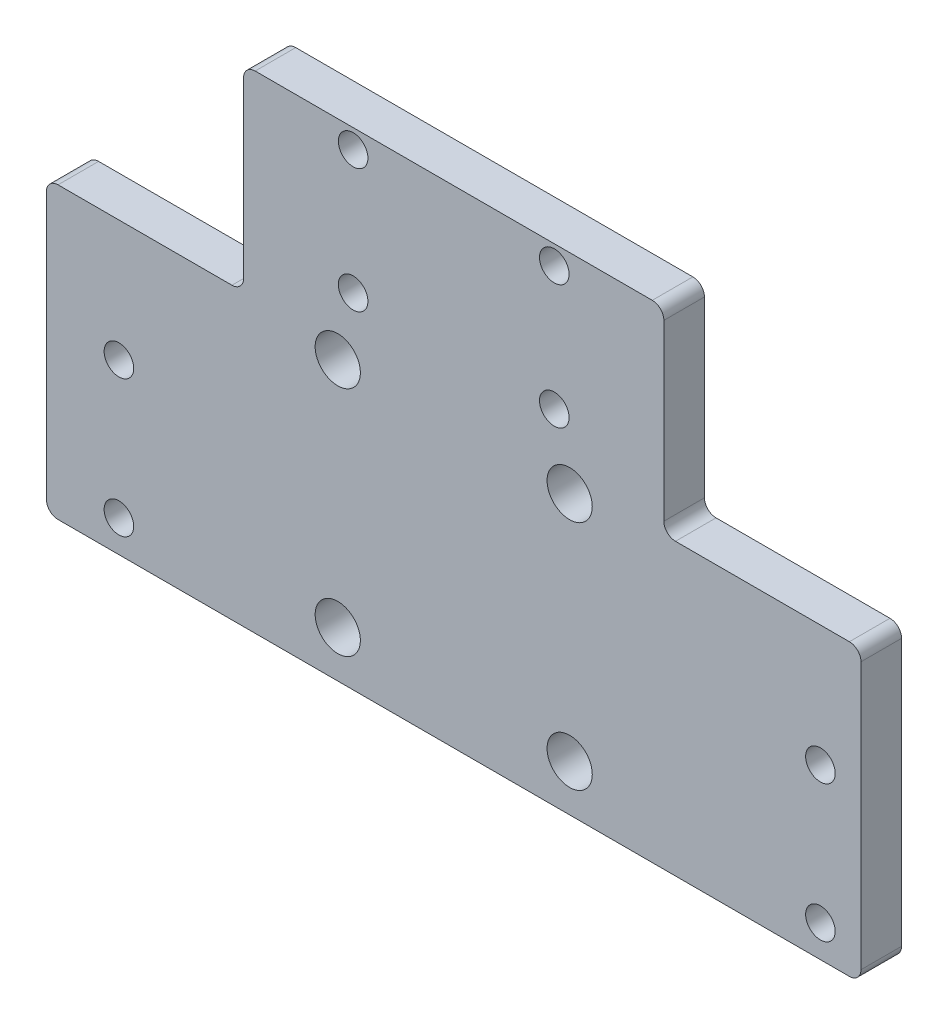
ISO-10303-21;
HEADER;
FILE_DESCRIPTION(('STEP AP214'),'2;1');
FILE_NAME('part.step','',(''),(''),'','','');
FILE_SCHEMA(('AUTOMOTIVE_DESIGN { 1 0 10303 214 1 1 1 1 }'));
ENDSEC;
DATA;
#1=APPLICATION_CONTEXT('core data for automotive mechanical design processes');
#2=APPLICATION_PROTOCOL_DEFINITION('international standard','automotive_design',2000,#1);
#3=PRODUCT_CONTEXT('',#1,'mechanical');
#4=PRODUCT('Part','Part','',(#3));
#5=PRODUCT_RELATED_PRODUCT_CATEGORY('part','',(#4));
#6=PRODUCT_DEFINITION_FORMATION('','',#4);
#7=PRODUCT_DEFINITION_CONTEXT('part definition',#1,'design');
#8=PRODUCT_DEFINITION('design','',#6,#7);
#9=PRODUCT_DEFINITION_SHAPE('','',#8);
#10=(LENGTH_UNIT() NAMED_UNIT(*) SI_UNIT(.MILLI.,.METRE.));
#11=(NAMED_UNIT(*) PLANE_ANGLE_UNIT() SI_UNIT($,.RADIAN.));
#12=(NAMED_UNIT(*) SI_UNIT($,.STERADIAN.) SOLID_ANGLE_UNIT());
#13=UNCERTAINTY_MEASURE_WITH_UNIT(LENGTH_MEASURE(1.E-05),#10,'distance_accuracy_value','');
#14=(GEOMETRIC_REPRESENTATION_CONTEXT(3) GLOBAL_UNCERTAINTY_ASSIGNED_CONTEXT((#13)) GLOBAL_UNIT_ASSIGNED_CONTEXT((#10,
#11,#12)) REPRESENTATION_CONTEXT('',''));
#15=CARTESIAN_POINT('',(0.,0.,0.));
#16=DIRECTION('',(0.,0.,1.));
#17=DIRECTION('',(1.,0.,0.));
#18=AXIS2_PLACEMENT_3D('',#15,#16,#17);
#19=CARTESIAN_POINT('',(0.,0.,7.));
#20=DIRECTION('',(0.,0.,1.));
#21=DIRECTION('',(1.,0.,0.));
#22=AXIS2_PLACEMENT_3D('',#19,#20,#21);
#23=PLANE('',#22);
#24=CARTESIAN_POINT('',(17.35,125.3,7.));
#25=DIRECTION('',(0.,0.,1.));
#26=DIRECTION('',(1.,0.,0.));
#27=AXIS2_PLACEMENT_3D('',#24,#25,#26);
#28=CIRCLE('',#27,2.55);
#29=CARTESIAN_POINT('',(19.9,125.3,7.));
#30=VERTEX_POINT('',#29);
#31=EDGE_CURVE('E483',#30,#30,#28,.T.);
#32=ORIENTED_EDGE('',*,*,#31,.F.);
#33=EDGE_LOOP('',(#32));
#34=FACE_BOUND('',#33,.T.);
#35=CARTESIAN_POINT('',(63.25,95.1,7.));
#36=DIRECTION('',(0.,0.,1.));
#37=DIRECTION('',(1.,0.,0.));
#38=AXIS2_PLACEMENT_3D('',#35,#36,#37);
#39=CIRCLE('',#38,2.54999999999999);
#40=CARTESIAN_POINT('',(65.8,95.1,7.));
#41=VERTEX_POINT('',#40);
#42=EDGE_CURVE('E492',#41,#41,#39,.T.);
#43=ORIENTED_EDGE('',*,*,#42,.F.);
#44=EDGE_LOOP('',(#43));
#45=FACE_BOUND('',#44,.T.);
#46=CARTESIAN_POINT('',(63.25,71.5,7.));
#47=DIRECTION('',(0.,0.,1.));
#48=DIRECTION('',(1.,0.,0.));
#49=AXIS2_PLACEMENT_3D('',#46,#47,#48);
#50=CIRCLE('',#49,2.54999999999999);
#51=CARTESIAN_POINT('',(65.8,71.5,7.));
#52=VERTEX_POINT('',#51);
#53=EDGE_CURVE('E467',#52,#52,#50,.T.);
#54=ORIENTED_EDGE('',*,*,#53,.F.);
#55=EDGE_LOOP('',(#54));
#56=FACE_BOUND('',#55,.T.);
#57=CARTESIAN_POINT('',(-57.75,95.1,7.));
#58=DIRECTION('',(0.,0.,1.));
#59=DIRECTION('',(1.,0.,0.));
#60=AXIS2_PLACEMENT_3D('',#57,#58,#59);
#61=CIRCLE('',#60,2.55);
#62=CARTESIAN_POINT('',(-55.2,95.1,7.));
#63=VERTEX_POINT('',#62);
#64=EDGE_CURVE('E476',#63,#63,#61,.T.);
#65=ORIENTED_EDGE('',*,*,#64,.F.);
#66=EDGE_LOOP('',(#65));
#67=FACE_BOUND('',#66,.T.);
#68=CARTESIAN_POINT('',(-17.35,146.7,7.));
#69=DIRECTION('',(0.,0.,1.));
#70=DIRECTION('',(1.,0.,0.));
#71=AXIS2_PLACEMENT_3D('',#68,#69,#70);
#72=CIRCLE('',#71,2.55);
#73=CARTESIAN_POINT('',(-14.8,146.7,7.));
#74=VERTEX_POINT('',#73);
#75=EDGE_CURVE('E515',#74,#74,#72,.T.);
#76=ORIENTED_EDGE('',*,*,#75,.F.);
#77=EDGE_LOOP('',(#76));
#78=FACE_BOUND('',#77,.T.);
#79=CARTESIAN_POINT('',(-17.35,125.3,7.));
#80=DIRECTION('',(0.,0.,1.));
#81=DIRECTION('',(-1.,0.,0.));
#82=AXIS2_PLACEMENT_3D('',#79,#80,#81);
#83=CIRCLE('',#82,2.55);
#84=CARTESIAN_POINT('',(-19.9,125.3,7.));
#85=VERTEX_POINT('',#84);
#86=EDGE_CURVE('E499',#85,#85,#83,.T.);
#87=ORIENTED_EDGE('',*,*,#86,.F.);
#88=EDGE_LOOP('',(#87));
#89=FACE_BOUND('',#88,.T.);
#90=CARTESIAN_POINT('',(17.35,146.7,7.));
#91=DIRECTION('',(0.,0.,1.));
#92=DIRECTION('',(-1.,0.,0.));
#93=AXIS2_PLACEMENT_3D('',#90,#91,#92);
#94=CIRCLE('',#93,2.55);
#95=CARTESIAN_POINT('',(14.8,146.7,7.));
#96=VERTEX_POINT('',#95);
#97=EDGE_CURVE('E508',#96,#96,#94,.T.);
#98=ORIENTED_EDGE('',*,*,#97,.F.);
#99=EDGE_LOOP('',(#98));
#100=FACE_BOUND('',#99,.T.);
#101=CARTESIAN_POINT('',(-57.75,71.5,7.));
#102=DIRECTION('',(0.,0.,1.));
#103=DIRECTION('',(1.,0.,0.));
#104=AXIS2_PLACEMENT_3D('',#101,#102,#103);
#105=CIRCLE('',#104,2.55);
#106=CARTESIAN_POINT('',(-55.2,71.5,7.));
#107=VERTEX_POINT('',#106);
#108=EDGE_CURVE('E459',#107,#107,#105,.T.);
#109=ORIENTED_EDGE('',*,*,#108,.F.);
#110=EDGE_LOOP('',(#109));
#111=FACE_BOUND('',#110,.T.);
#112=CARTESIAN_POINT('',(20.,74.,7.));
#113=DIRECTION('',(0.,0.,1.));
#114=DIRECTION('',(1.,0.,0.));
#115=AXIS2_PLACEMENT_3D('',#112,#113,#114);
#116=CIRCLE('',#115,3.9);
#117=CARTESIAN_POINT('',(23.9,74.,7.));
#118=VERTEX_POINT('',#117);
#119=EDGE_CURVE('E439',#118,#118,#116,.T.);
#120=ORIENTED_EDGE('',*,*,#119,.F.);
#121=EDGE_LOOP('',(#120));
#122=FACE_BOUND('',#121,.T.);
#123=CARTESIAN_POINT('',(-20.,114.,7.));
#124=DIRECTION('',(0.,0.,1.));
#125=DIRECTION('',(1.,0.,0.));
#126=AXIS2_PLACEMENT_3D('',#123,#124,#125);
#127=CIRCLE('',#126,3.9);
#128=CARTESIAN_POINT('',(-16.1,114.,7.));
#129=VERTEX_POINT('',#128);
#130=EDGE_CURVE('E314',#129,#129,#127,.T.);
#131=ORIENTED_EDGE('',*,*,#130,.F.);
#132=EDGE_LOOP('',(#131));
#133=FACE_BOUND('',#132,.T.);
#134=DIRECTION('',(0.,1.,0.));
#135=VECTOR('',#134,1.);
#136=CARTESIAN_POINT('',(70.25,66.,7.));
#137=LINE('',#136,#135);
#138=CARTESIAN_POINT('',(70.25,68.,7.));
#139=VERTEX_POINT('',#138);
#140=CARTESIAN_POINT('',(70.25,114.,7.));
#141=VERTEX_POINT('',#140);
#142=EDGE_CURVE('E331',#139,#141,#137,.T.);
#143=ORIENTED_EDGE('',*,*,#142,.T.);
#144=CARTESIAN_POINT('',(68.25,114.,7.));
#145=DIRECTION('',(0.,0.,1.));
#146=DIRECTION('',(1.,0.,0.));
#147=AXIS2_PLACEMENT_3D('',#144,#145,#146);
#148=CIRCLE('',#147,2.);
#149=CARTESIAN_POINT('',(68.25,116.,7.));
#150=VERTEX_POINT('',#149);
#151=EDGE_CURVE('E243',#141,#150,#148,.T.);
#152=ORIENTED_EDGE('',*,*,#151,.T.);
#153=DIRECTION('',(-1.,0.,0.));
#154=VECTOR('',#153,1.);
#155=CARTESIAN_POINT('',(70.25,116.,7.));
#156=LINE('',#155,#154);
#157=CARTESIAN_POINT('',(38.25,116.,7.));
#158=VERTEX_POINT('',#157);
#159=EDGE_CURVE('E174',#150,#158,#156,.T.);
#160=ORIENTED_EDGE('',*,*,#159,.T.);
#161=CARTESIAN_POINT('',(38.25,118.,7.));
#162=DIRECTION('',(0.,0.,1.));
#163=DIRECTION('',(1.,0.,0.));
#164=AXIS2_PLACEMENT_3D('',#161,#162,#163);
#165=CIRCLE('',#164,2.);
#166=CARTESIAN_POINT('',(36.25,118.,7.));
#167=VERTEX_POINT('',#166);
#168=EDGE_CURVE('E289',#158,#167,#165,.F.);
#169=ORIENTED_EDGE('',*,*,#168,.T.);
#170=DIRECTION('',(0.,1.,0.));
#171=VECTOR('',#170,1.);
#172=CARTESIAN_POINT('',(36.25,116.,7.));
#173=LINE('',#172,#171);
#174=CARTESIAN_POINT('',(36.25,148.,7.));
#175=VERTEX_POINT('',#174);
#176=EDGE_CURVE('E339',#167,#175,#173,.T.);
#177=ORIENTED_EDGE('',*,*,#176,.T.);
#178=CARTESIAN_POINT('',(34.25,148.,7.));
#179=DIRECTION('',(0.,0.,1.));
#180=DIRECTION('',(1.,0.,0.));
#181=AXIS2_PLACEMENT_3D('',#178,#179,#180);
#182=CIRCLE('',#181,2.);
#183=CARTESIAN_POINT('',(34.25,150.,7.));
#184=VERTEX_POINT('',#183);
#185=EDGE_CURVE('E231',#175,#184,#182,.T.);
#186=ORIENTED_EDGE('',*,*,#185,.T.);
#187=DIRECTION('',(-1.,0.,0.));
#188=VECTOR('',#187,1.);
#189=CARTESIAN_POINT('',(36.25,150.,7.));
#190=LINE('',#189,#188);
#191=CARTESIAN_POINT('',(-34.25,150.,7.));
#192=VERTEX_POINT('',#191);
#193=EDGE_CURVE('E307',#184,#192,#190,.T.);
#194=ORIENTED_EDGE('',*,*,#193,.T.);
#195=CARTESIAN_POINT('',(-34.25,148.,7.));
#196=DIRECTION('',(0.,0.,1.));
#197=DIRECTION('',(1.,0.,0.));
#198=AXIS2_PLACEMENT_3D('',#195,#196,#197);
#199=CIRCLE('',#198,2.);
#200=CARTESIAN_POINT('',(-36.25,148.,7.));
#201=VERTEX_POINT('',#200);
#202=EDGE_CURVE('E228',#192,#201,#199,.T.);
#203=ORIENTED_EDGE('',*,*,#202,.T.);
#204=DIRECTION('',(0.,-1.,0.));
#205=VECTOR('',#204,1.);
#206=CARTESIAN_POINT('',(-36.25,150.,7.));
#207=LINE('',#206,#205);
#208=CARTESIAN_POINT('',(-36.25,118.,7.));
#209=VERTEX_POINT('',#208);
#210=EDGE_CURVE('E304',#201,#209,#207,.T.);
#211=ORIENTED_EDGE('',*,*,#210,.T.);
#212=CARTESIAN_POINT('',(-38.25,118.,7.));
#213=DIRECTION('',(0.,0.,1.));
#214=DIRECTION('',(1.,0.,0.));
#215=AXIS2_PLACEMENT_3D('',#212,#213,#214);
#216=CIRCLE('',#215,2.);
#217=CARTESIAN_POINT('',(-38.25,116.,7.));
#218=VERTEX_POINT('',#217);
#219=EDGE_CURVE('E11',#209,#218,#216,.F.);
#220=ORIENTED_EDGE('',*,*,#219,.T.);
#221=DIRECTION('',(-1.,0.,0.));
#222=VECTOR('',#221,1.);
#223=CARTESIAN_POINT('',(-36.25,116.,7.));
#224=LINE('',#223,#222);
#225=CARTESIAN_POINT('',(-68.25,116.,7.));
#226=VERTEX_POINT('',#225);
#227=EDGE_CURVE('E208',#218,#226,#224,.T.);
#228=ORIENTED_EDGE('',*,*,#227,.T.);
#229=CARTESIAN_POINT('',(-68.25,114.,7.));
#230=DIRECTION('',(0.,0.,1.));
#231=DIRECTION('',(1.,0.,0.));
#232=AXIS2_PLACEMENT_3D('',#229,#230,#231);
#233=CIRCLE('',#232,2.);
#234=CARTESIAN_POINT('',(-70.25,114.,7.));
#235=VERTEX_POINT('',#234);
#236=EDGE_CURVE('E240',#226,#235,#233,.T.);
#237=ORIENTED_EDGE('',*,*,#236,.T.);
#238=DIRECTION('',(0.,-1.,0.));
#239=VECTOR('',#238,1.);
#240=CARTESIAN_POINT('',(-70.25,116.,7.));
#241=LINE('',#240,#239);
#242=CARTESIAN_POINT('',(-70.25,68.,7.));
#243=VERTEX_POINT('',#242);
#244=EDGE_CURVE('E206',#235,#243,#241,.T.);
#245=ORIENTED_EDGE('',*,*,#244,.T.);
#246=CARTESIAN_POINT('',(-68.25,68.,7.));
#247=DIRECTION('',(0.,0.,1.));
#248=DIRECTION('',(1.,0.,0.));
#249=AXIS2_PLACEMENT_3D('',#246,#247,#248);
#250=CIRCLE('',#249,2.);
#251=CARTESIAN_POINT('',(-68.25,66.,7.));
#252=VERTEX_POINT('',#251);
#253=EDGE_CURVE('E237',#243,#252,#250,.T.);
#254=ORIENTED_EDGE('',*,*,#253,.T.);
#255=DIRECTION('',(1.,0.,0.));
#256=VECTOR('',#255,1.);
#257=CARTESIAN_POINT('',(-70.25,66.,7.));
#258=LINE('',#257,#256);
#259=CARTESIAN_POINT('',(68.25,66.,7.));
#260=VERTEX_POINT('',#259);
#261=EDGE_CURVE('E332',#252,#260,#258,.T.);
#262=ORIENTED_EDGE('',*,*,#261,.T.);
#263=CARTESIAN_POINT('',(68.25,68.,7.));
#264=DIRECTION('',(0.,0.,1.));
#265=DIRECTION('',(1.,0.,0.));
#266=AXIS2_PLACEMENT_3D('',#263,#264,#265);
#267=CIRCLE('',#266,2.);
#268=EDGE_CURVE('E234',#260,#139,#267,.T.);
#269=ORIENTED_EDGE('',*,*,#268,.T.);
#270=EDGE_LOOP('',(#143,#152,#160,#169,#177,#186,#194,#203,#211,#220,#228,#237,#245,#254,#262,#269));
#271=FACE_BOUND('',#270,.T.);
#272=CARTESIAN_POINT('',(-20.,74.,7.));
#273=DIRECTION('',(0.,0.,1.));
#274=DIRECTION('',(1.,0.,0.));
#275=AXIS2_PLACEMENT_3D('',#272,#273,#274);
#276=CIRCLE('',#275,3.9);
#277=CARTESIAN_POINT('',(-16.1,74.,7.));
#278=VERTEX_POINT('',#277);
#279=EDGE_CURVE('E431',#278,#278,#276,.T.);
#280=ORIENTED_EDGE('',*,*,#279,.F.);
#281=EDGE_LOOP('',(#280));
#282=FACE_BOUND('',#281,.T.);
#283=CARTESIAN_POINT('',(20.,114.,7.));
#284=DIRECTION('',(0.,0.,1.));
#285=DIRECTION('',(1.,0.,0.));
#286=AXIS2_PLACEMENT_3D('',#283,#284,#285);
#287=CIRCLE('',#286,3.9);
#288=CARTESIAN_POINT('',(23.9,114.,7.));
#289=VERTEX_POINT('',#288);
#290=EDGE_CURVE('E447',#289,#289,#287,.T.);
#291=ORIENTED_EDGE('',*,*,#290,.F.);
#292=EDGE_LOOP('',(#291));
#293=FACE_BOUND('',#292,.T.);
#294=ADVANCED_FACE('F39',(#34,#45,#56,#67,#78,#89,#100,#111,#122,#133,#271,#282,#293),#23,.T.);
#295=CARTESIAN_POINT('',(0.,0.,0.));
#296=DIRECTION('',(0.,0.,1.));
#297=DIRECTION('',(1.,0.,0.));
#298=AXIS2_PLACEMENT_3D('',#295,#296,#297);
#299=PLANE('',#298);
#300=CARTESIAN_POINT('',(17.35,125.3,0.));
#301=DIRECTION('',(0.,0.,1.));
#302=DIRECTION('',(1.,0.,0.));
#303=AXIS2_PLACEMENT_3D('',#300,#301,#302);
#304=CIRCLE('',#303,2.55);
#305=CARTESIAN_POINT('',(19.9,125.3,0.));
#306=VERTEX_POINT('',#305);
#307=EDGE_CURVE('E487',#306,#306,#304,.T.);
#308=ORIENTED_EDGE('',*,*,#307,.T.);
#309=EDGE_LOOP('',(#308));
#310=FACE_BOUND('',#309,.T.);
#311=CARTESIAN_POINT('',(63.25,95.1,0.));
#312=DIRECTION('',(0.,0.,1.));
#313=DIRECTION('',(1.,0.,0.));
#314=AXIS2_PLACEMENT_3D('',#311,#312,#313);
#315=CIRCLE('',#314,2.54999999999999);
#316=CARTESIAN_POINT('',(65.8,95.1,0.));
#317=VERTEX_POINT('',#316);
#318=EDGE_CURVE('E472',#317,#317,#315,.T.);
#319=ORIENTED_EDGE('',*,*,#318,.T.);
#320=EDGE_LOOP('',(#319));
#321=FACE_BOUND('',#320,.T.);
#322=CARTESIAN_POINT('',(63.25,71.5,0.));
#323=DIRECTION('',(0.,0.,1.));
#324=DIRECTION('',(1.,0.,0.));
#325=AXIS2_PLACEMENT_3D('',#322,#323,#324);
#326=CIRCLE('',#325,2.54999999999999);
#327=CARTESIAN_POINT('',(65.8,71.5,0.));
#328=VERTEX_POINT('',#327);
#329=EDGE_CURVE('E471',#328,#328,#326,.T.);
#330=ORIENTED_EDGE('',*,*,#329,.T.);
#331=EDGE_LOOP('',(#330));
#332=FACE_BOUND('',#331,.T.);
#333=CARTESIAN_POINT('',(-57.75,95.1,0.));
#334=DIRECTION('',(0.,0.,1.));
#335=DIRECTION('',(1.,0.,0.));
#336=AXIS2_PLACEMENT_3D('',#333,#334,#335);
#337=CIRCLE('',#336,2.55);
#338=CARTESIAN_POINT('',(-55.2,95.1,0.));
#339=VERTEX_POINT('',#338);
#340=EDGE_CURVE('E463',#339,#339,#337,.T.);
#341=ORIENTED_EDGE('',*,*,#340,.T.);
#342=EDGE_LOOP('',(#341));
#343=FACE_BOUND('',#342,.T.);
#344=CARTESIAN_POINT('',(-17.35,146.7,0.));
#345=DIRECTION('',(0.,0.,1.));
#346=DIRECTION('',(1.,0.,0.));
#347=AXIS2_PLACEMENT_3D('',#344,#345,#346);
#348=CIRCLE('',#347,2.55);
#349=CARTESIAN_POINT('',(-14.8,146.7,0.));
#350=VERTEX_POINT('',#349);
#351=EDGE_CURVE('E504',#350,#350,#348,.T.);
#352=ORIENTED_EDGE('',*,*,#351,.T.);
#353=EDGE_LOOP('',(#352));
#354=FACE_BOUND('',#353,.T.);
#355=CARTESIAN_POINT('',(-17.35,125.3,0.));
#356=DIRECTION('',(0.,0.,1.));
#357=DIRECTION('',(-1.,0.,0.));
#358=AXIS2_PLACEMENT_3D('',#355,#356,#357);
#359=CIRCLE('',#358,2.55);
#360=CARTESIAN_POINT('',(-19.9,125.3,0.));
#361=VERTEX_POINT('',#360);
#362=EDGE_CURVE('E503',#361,#361,#359,.T.);
#363=ORIENTED_EDGE('',*,*,#362,.T.);
#364=EDGE_LOOP('',(#363));
#365=FACE_BOUND('',#364,.T.);
#366=CARTESIAN_POINT('',(17.35,146.7,0.));
#367=DIRECTION('',(0.,0.,1.));
#368=DIRECTION('',(-1.,0.,0.));
#369=AXIS2_PLACEMENT_3D('',#366,#367,#368);
#370=CIRCLE('',#369,2.55);
#371=CARTESIAN_POINT('',(14.8,146.7,0.));
#372=VERTEX_POINT('',#371);
#373=EDGE_CURVE('E488',#372,#372,#370,.T.);
#374=ORIENTED_EDGE('',*,*,#373,.T.);
#375=EDGE_LOOP('',(#374));
#376=FACE_BOUND('',#375,.T.);
#377=CARTESIAN_POINT('',(-57.75,71.5,0.));
#378=DIRECTION('',(0.,0.,1.));
#379=DIRECTION('',(1.,0.,0.));
#380=AXIS2_PLACEMENT_3D('',#377,#378,#379);
#381=CIRCLE('',#380,2.55);
#382=CARTESIAN_POINT('',(-55.2,71.5,0.));
#383=VERTEX_POINT('',#382);
#384=EDGE_CURVE('E455',#383,#383,#381,.T.);
#385=ORIENTED_EDGE('',*,*,#384,.T.);
#386=EDGE_LOOP('',(#385));
#387=FACE_BOUND('',#386,.T.);
#388=DIRECTION('',(-1.,0.,0.));
#389=VECTOR('',#388,1.);
#390=CARTESIAN_POINT('',(70.25,116.,0.));
#391=LINE('',#390,#389);
#392=CARTESIAN_POINT('',(68.25,116.,0.));
#393=VERTEX_POINT('',#392);
#394=CARTESIAN_POINT('',(38.25,116.,0.));
#395=VERTEX_POINT('',#394);
#396=EDGE_CURVE('E171',#393,#395,#391,.T.);
#397=ORIENTED_EDGE('',*,*,#396,.F.);
#398=CARTESIAN_POINT('',(68.25,114.,0.));
#399=DIRECTION('',(0.,0.,1.));
#400=DIRECTION('',(1.,0.,0.));
#401=AXIS2_PLACEMENT_3D('',#398,#399,#400);
#402=CIRCLE('',#401,2.);
#403=CARTESIAN_POINT('',(70.25,114.,0.));
#404=VERTEX_POINT('',#403);
#405=EDGE_CURVE('E153',#393,#404,#402,.F.);
#406=ORIENTED_EDGE('',*,*,#405,.T.);
#407=DIRECTION('',(0.,1.,0.));
#408=VECTOR('',#407,1.);
#409=CARTESIAN_POINT('',(70.25,66.,0.));
#410=LINE('',#409,#408);
#411=CARTESIAN_POINT('',(70.25,68.,0.));
#412=VERTEX_POINT('',#411);
#413=EDGE_CURVE('E185',#412,#404,#410,.T.);
#414=ORIENTED_EDGE('',*,*,#413,.F.);
#415=CARTESIAN_POINT('',(68.25,68.,0.));
#416=DIRECTION('',(0.,0.,1.));
#417=DIRECTION('',(1.,0.,0.));
#418=AXIS2_PLACEMENT_3D('',#415,#416,#417);
#419=CIRCLE('',#418,2.);
#420=CARTESIAN_POINT('',(68.25,66.,0.));
#421=VERTEX_POINT('',#420);
#422=EDGE_CURVE('E215',#412,#421,#419,.F.);
#423=ORIENTED_EDGE('',*,*,#422,.T.);
#424=DIRECTION('',(1.,0.,0.));
#425=VECTOR('',#424,1.);
#426=CARTESIAN_POINT('',(-70.25,66.,0.));
#427=LINE('',#426,#425);
#428=CARTESIAN_POINT('',(-68.25,66.,0.));
#429=VERTEX_POINT('',#428);
#430=EDGE_CURVE('E192',#429,#421,#427,.T.);
#431=ORIENTED_EDGE('',*,*,#430,.F.);
#432=CARTESIAN_POINT('',(-68.25,68.,0.));
#433=DIRECTION('',(0.,0.,1.));
#434=DIRECTION('',(1.,0.,0.));
#435=AXIS2_PLACEMENT_3D('',#432,#433,#434);
#436=CIRCLE('',#435,2.);
#437=CARTESIAN_POINT('',(-70.25,68.,0.));
#438=VERTEX_POINT('',#437);
#439=EDGE_CURVE('E218',#429,#438,#436,.F.);
#440=ORIENTED_EDGE('',*,*,#439,.T.);
#441=DIRECTION('',(0.,-1.,0.));
#442=VECTOR('',#441,1.);
#443=CARTESIAN_POINT('',(-70.25,116.,0.));
#444=LINE('',#443,#442);
#445=CARTESIAN_POINT('',(-70.25,114.,0.));
#446=VERTEX_POINT('',#445);
#447=EDGE_CURVE('E311',#446,#438,#444,.T.);
#448=ORIENTED_EDGE('',*,*,#447,.F.);
#449=CARTESIAN_POINT('',(-68.25,114.,0.));
#450=DIRECTION('',(0.,0.,1.));
#451=DIRECTION('',(1.,0.,0.));
#452=AXIS2_PLACEMENT_3D('',#449,#450,#451);
#453=CIRCLE('',#452,2.);
#454=CARTESIAN_POINT('',(-68.25,116.,0.));
#455=VERTEX_POINT('',#454);
#456=EDGE_CURVE('E165',#446,#455,#453,.F.);
#457=ORIENTED_EDGE('',*,*,#456,.T.);
#458=DIRECTION('',(-1.,0.,0.));
#459=VECTOR('',#458,1.);
#460=CARTESIAN_POINT('',(-36.25,116.,0.));
#461=LINE('',#460,#459);
#462=CARTESIAN_POINT('',(-38.25,116.,0.));
#463=VERTEX_POINT('',#462);
#464=EDGE_CURVE('E203',#463,#455,#461,.T.);
#465=ORIENTED_EDGE('',*,*,#464,.F.);
#466=CARTESIAN_POINT('',(-38.25,118.,0.));
#467=DIRECTION('',(0.,0.,1.));
#468=DIRECTION('',(1.,0.,0.));
#469=AXIS2_PLACEMENT_3D('',#466,#467,#468);
#470=CIRCLE('',#469,2.);
#471=CARTESIAN_POINT('',(-36.25,118.,0.));
#472=VERTEX_POINT('',#471);
#473=EDGE_CURVE('E48',#463,#472,#470,.T.);
#474=ORIENTED_EDGE('',*,*,#473,.T.);
#475=DIRECTION('',(0.,-1.,0.));
#476=VECTOR('',#475,1.);
#477=CARTESIAN_POINT('',(-36.25,150.,0.));
#478=LINE('',#477,#476);
#479=CARTESIAN_POINT('',(-36.25,148.,0.));
#480=VERTEX_POINT('',#479);
#481=EDGE_CURVE('E199',#480,#472,#478,.T.);
#482=ORIENTED_EDGE('',*,*,#481,.F.);
#483=CARTESIAN_POINT('',(-34.25,148.,0.));
#484=DIRECTION('',(0.,0.,1.));
#485=DIRECTION('',(1.,0.,0.));
#486=AXIS2_PLACEMENT_3D('',#483,#484,#485);
#487=CIRCLE('',#486,2.);
#488=CARTESIAN_POINT('',(-34.25,150.,0.));
#489=VERTEX_POINT('',#488);
#490=EDGE_CURVE('E176',#480,#489,#487,.F.);
#491=ORIENTED_EDGE('',*,*,#490,.T.);
#492=DIRECTION('',(-1.,0.,0.));
#493=VECTOR('',#492,1.);
#494=CARTESIAN_POINT('',(36.25,150.,0.));
#495=LINE('',#494,#493);
#496=CARTESIAN_POINT('',(34.25,150.,0.));
#497=VERTEX_POINT('',#496);
#498=EDGE_CURVE('E190',#497,#489,#495,.T.);
#499=ORIENTED_EDGE('',*,*,#498,.F.);
#500=CARTESIAN_POINT('',(34.25,148.,0.));
#501=DIRECTION('',(0.,0.,1.));
#502=DIRECTION('',(1.,0.,0.));
#503=AXIS2_PLACEMENT_3D('',#500,#501,#502);
#504=CIRCLE('',#503,2.);
#505=CARTESIAN_POINT('',(36.25,148.,0.));
#506=VERTEX_POINT('',#505);
#507=EDGE_CURVE('E212',#497,#506,#504,.F.);
#508=ORIENTED_EDGE('',*,*,#507,.T.);
#509=DIRECTION('',(0.,1.,0.));
#510=VECTOR('',#509,1.);
#511=CARTESIAN_POINT('',(36.25,116.,0.));
#512=LINE('',#511,#510);
#513=CARTESIAN_POINT('',(36.25,118.,0.));
#514=VERTEX_POINT('',#513);
#515=EDGE_CURVE('E184',#514,#506,#512,.T.);
#516=ORIENTED_EDGE('',*,*,#515,.F.);
#517=CARTESIAN_POINT('',(38.25,118.,0.));
#518=DIRECTION('',(0.,0.,1.));
#519=DIRECTION('',(1.,0.,0.));
#520=AXIS2_PLACEMENT_3D('',#517,#518,#519);
#521=CIRCLE('',#520,2.);
#522=EDGE_CURVE('E182',#514,#395,#521,.T.);
#523=ORIENTED_EDGE('',*,*,#522,.T.);
#524=EDGE_LOOP('',(#397,#406,#414,#423,#431,#440,#448,#457,#465,#474,#482,#491,#499,#508,#516,#523));
#525=FACE_BOUND('',#524,.T.);
#526=CARTESIAN_POINT('',(-20.,114.,0.));
#527=DIRECTION('',(0.,0.,1.));
#528=DIRECTION('',(1.,0.,0.));
#529=AXIS2_PLACEMENT_3D('',#526,#527,#528);
#530=CIRCLE('',#529,3.9);
#531=CARTESIAN_POINT('',(-16.1,114.,0.));
#532=VERTEX_POINT('',#531);
#533=EDGE_CURVE('E427',#532,#532,#530,.T.);
#534=ORIENTED_EDGE('',*,*,#533,.T.);
#535=EDGE_LOOP('',(#534));
#536=FACE_BOUND('',#535,.T.);
#537=CARTESIAN_POINT('',(-20.,74.,0.));
#538=DIRECTION('',(0.,0.,1.));
#539=DIRECTION('',(1.,0.,0.));
#540=AXIS2_PLACEMENT_3D('',#537,#538,#539);
#541=CIRCLE('',#540,3.9);
#542=CARTESIAN_POINT('',(-16.1,74.,0.));
#543=VERTEX_POINT('',#542);
#544=EDGE_CURVE('E435',#543,#543,#541,.T.);
#545=ORIENTED_EDGE('',*,*,#544,.T.);
#546=EDGE_LOOP('',(#545));
#547=FACE_BOUND('',#546,.T.);
#548=CARTESIAN_POINT('',(20.,74.,0.));
#549=DIRECTION('',(0.,0.,1.));
#550=DIRECTION('',(1.,0.,0.));
#551=AXIS2_PLACEMENT_3D('',#548,#549,#550);
#552=CIRCLE('',#551,3.9);
#553=CARTESIAN_POINT('',(23.9,74.,0.));
#554=VERTEX_POINT('',#553);
#555=EDGE_CURVE('E443',#554,#554,#552,.T.);
#556=ORIENTED_EDGE('',*,*,#555,.T.);
#557=EDGE_LOOP('',(#556));
#558=FACE_BOUND('',#557,.T.);
#559=CARTESIAN_POINT('',(20.,114.,0.));
#560=DIRECTION('',(0.,0.,1.));
#561=DIRECTION('',(1.,0.,0.));
#562=AXIS2_PLACEMENT_3D('',#559,#560,#561);
#563=CIRCLE('',#562,3.9);
#564=CARTESIAN_POINT('',(23.9,114.,0.));
#565=VERTEX_POINT('',#564);
#566=EDGE_CURVE('E451',#565,#565,#563,.T.);
#567=ORIENTED_EDGE('',*,*,#566,.T.);
#568=EDGE_LOOP('',(#567));
#569=FACE_BOUND('',#568,.T.);
#570=ADVANCED_FACE('F179',(#310,#321,#332,#343,#354,#365,#376,#387,#525,#536,#547,#558,#569),
#299,.F.);
#571=CARTESIAN_POINT('',(-70.25,116.,7.));
#572=DIRECTION('',(1.,0.,0.));
#573=DIRECTION('',(0.,0.,-1.));
#574=AXIS2_PLACEMENT_3D('',#571,#572,#573);
#575=PLANE('',#574);
#576=ORIENTED_EDGE('',*,*,#244,.F.);
#577=DIRECTION('',(0.,0.,-1.));
#578=VECTOR('',#577,1.);
#579=CARTESIAN_POINT('',(-70.25,114.,7.));
#580=LINE('',#579,#578);
#581=EDGE_CURVE('E249',#235,#446,#580,.T.);
#582=ORIENTED_EDGE('',*,*,#581,.T.);
#583=ORIENTED_EDGE('',*,*,#447,.T.);
#584=DIRECTION('',(0.,0.,-1.));
#585=VECTOR('',#584,1.);
#586=CARTESIAN_POINT('',(-70.25,68.,7.));
#587=LINE('',#586,#585);
#588=EDGE_CURVE('E246',#438,#243,#587,.F.);
#589=ORIENTED_EDGE('',*,*,#588,.T.);
#590=EDGE_LOOP('',(#576,#582,#583,#589));
#591=FACE_BOUND('',#590,.T.);
#592=ADVANCED_FACE('F383',(#591),#575,.F.);
#593=CARTESIAN_POINT('',(-70.25,66.,7.));
#594=DIRECTION('',(0.,1.,0.));
#595=DIRECTION('',(0.,0.,1.));
#596=AXIS2_PLACEMENT_3D('',#593,#594,#595);
#597=PLANE('',#596);
#598=ORIENTED_EDGE('',*,*,#261,.F.);
#599=DIRECTION('',(0.,0.,-1.));
#600=VECTOR('',#599,1.);
#601=CARTESIAN_POINT('',(-68.25,66.,7.));
#602=LINE('',#601,#600);
#603=EDGE_CURVE('E262',#252,#429,#602,.T.);
#604=ORIENTED_EDGE('',*,*,#603,.T.);
#605=ORIENTED_EDGE('',*,*,#430,.T.);
#606=DIRECTION('',(0.,0.,-1.));
#607=VECTOR('',#606,1.);
#608=CARTESIAN_POINT('',(68.25,66.,7.));
#609=LINE('',#608,#607);
#610=EDGE_CURVE('E259',#421,#260,#609,.F.);
#611=ORIENTED_EDGE('',*,*,#610,.T.);
#612=EDGE_LOOP('',(#598,#604,#605,#611));
#613=FACE_BOUND('',#612,.T.);
#614=ADVANCED_FACE('F321',(#613),#597,.F.);
#615=CARTESIAN_POINT('',(70.25,66.,7.));
#616=DIRECTION('',(-1.,0.,0.));
#617=DIRECTION('',(0.,-1.,0.));
#618=AXIS2_PLACEMENT_3D('',#615,#616,#617);
#619=PLANE('',#618);
#620=ORIENTED_EDGE('',*,*,#413,.T.);
#621=DIRECTION('',(0.,0.,-1.));
#622=VECTOR('',#621,1.);
#623=CARTESIAN_POINT('',(70.25,114.,7.));
#624=LINE('',#623,#622);
#625=EDGE_CURVE('E158',#404,#141,#624,.F.);
#626=ORIENTED_EDGE('',*,*,#625,.T.);
#627=ORIENTED_EDGE('',*,*,#142,.F.);
#628=DIRECTION('',(0.,0.,-1.));
#629=VECTOR('',#628,1.);
#630=CARTESIAN_POINT('',(70.25,68.,7.));
#631=LINE('',#630,#629);
#632=EDGE_CURVE('E164',#139,#412,#631,.T.);
#633=ORIENTED_EDGE('',*,*,#632,.T.);
#634=EDGE_LOOP('',(#620,#626,#627,#633));
#635=FACE_BOUND('',#634,.T.);
#636=ADVANCED_FACE('F334',(#635),#619,.F.);
#637=CARTESIAN_POINT('',(70.25,116.,7.));
#638=DIRECTION('',(0.,-1.,0.));
#639=DIRECTION('',(1.,0.,0.));
#640=AXIS2_PLACEMENT_3D('',#637,#638,#639);
#641=PLANE('',#640);
#642=ORIENTED_EDGE('',*,*,#159,.F.);
#643=DIRECTION('',(0.,0.,-1.));
#644=VECTOR('',#643,1.);
#645=CARTESIAN_POINT('',(68.25,116.,7.));
#646=LINE('',#645,#644);
#647=EDGE_CURVE('E157',#150,#393,#646,.T.);
#648=ORIENTED_EDGE('',*,*,#647,.T.);
#649=ORIENTED_EDGE('',*,*,#396,.T.);
#650=DIRECTION('',(0.,0.,-1.));
#651=VECTOR('',#650,1.);
#652=CARTESIAN_POINT('',(38.25,116.,7.));
#653=LINE('',#652,#651);
#654=EDGE_CURVE('E177',#395,#158,#653,.F.);
#655=ORIENTED_EDGE('',*,*,#654,.T.);
#656=EDGE_LOOP('',(#642,#648,#649,#655));
#657=FACE_BOUND('',#656,.T.);
#658=ADVANCED_FACE('F170',(#657),#641,.F.);
#659=CARTESIAN_POINT('',(36.25,116.,7.));
#660=DIRECTION('',(-1.,0.,0.));
#661=DIRECTION('',(0.,0.,1.));
#662=AXIS2_PLACEMENT_3D('',#659,#660,#661);
#663=PLANE('',#662);
#664=ORIENTED_EDGE('',*,*,#176,.F.);
#665=DIRECTION('',(0.,0.,-1.));
#666=VECTOR('',#665,1.);
#667=CARTESIAN_POINT('',(36.25,118.,0.));
#668=LINE('',#667,#666);
#669=EDGE_CURVE('E269',#167,#514,#668,.T.);
#670=ORIENTED_EDGE('',*,*,#669,.T.);
#671=ORIENTED_EDGE('',*,*,#515,.T.);
#672=DIRECTION('',(0.,0.,-1.));
#673=VECTOR('',#672,1.);
#674=CARTESIAN_POINT('',(36.25,148.,7.));
#675=LINE('',#674,#673);
#676=EDGE_CURVE('E266',#506,#175,#675,.F.);
#677=ORIENTED_EDGE('',*,*,#676,.T.);
#678=EDGE_LOOP('',(#664,#670,#671,#677));
#679=FACE_BOUND('',#678,.T.);
#680=ADVANCED_FACE('F363',(#679),#663,.F.);
#681=CARTESIAN_POINT('',(36.25,150.,7.));
#682=DIRECTION('',(0.,-1.,0.));
#683=DIRECTION('',(1.,0.,0.));
#684=AXIS2_PLACEMENT_3D('',#681,#682,#683);
#685=PLANE('',#684);
#686=ORIENTED_EDGE('',*,*,#193,.F.);
#687=DIRECTION('',(0.,0.,-1.));
#688=VECTOR('',#687,1.);
#689=CARTESIAN_POINT('',(34.25,150.,7.));
#690=LINE('',#689,#688);
#691=EDGE_CURVE('E276',#184,#497,#690,.T.);
#692=ORIENTED_EDGE('',*,*,#691,.T.);
#693=ORIENTED_EDGE('',*,*,#498,.T.);
#694=DIRECTION('',(0.,0.,-1.));
#695=VECTOR('',#694,1.);
#696=CARTESIAN_POINT('',(-34.25,150.,7.));
#697=LINE('',#696,#695);
#698=EDGE_CURVE('E273',#489,#192,#697,.F.);
#699=ORIENTED_EDGE('',*,*,#698,.T.);
#700=EDGE_LOOP('',(#686,#692,#693,#699));
#701=FACE_BOUND('',#700,.T.);
#702=ADVANCED_FACE('F357',(#701),#685,.F.);
#703=CARTESIAN_POINT('',(-36.25,150.,7.));
#704=DIRECTION('',(1.,0.,0.));
#705=DIRECTION('',(0.,0.,-1.));
#706=AXIS2_PLACEMENT_3D('',#703,#704,#705);
#707=PLANE('',#706);
#708=ORIENTED_EDGE('',*,*,#210,.F.);
#709=DIRECTION('',(0.,0.,-1.));
#710=VECTOR('',#709,1.);
#711=CARTESIAN_POINT('',(-36.25,148.,7.));
#712=LINE('',#711,#710);
#713=EDGE_CURVE('E283',#201,#480,#712,.T.);
#714=ORIENTED_EDGE('',*,*,#713,.T.);
#715=ORIENTED_EDGE('',*,*,#481,.T.);
#716=DIRECTION('',(0.,0.,-1.));
#717=VECTOR('',#716,1.);
#718=CARTESIAN_POINT('',(-36.25,118.,7.));
#719=LINE('',#718,#717);
#720=EDGE_CURVE('E280',#472,#209,#719,.F.);
#721=ORIENTED_EDGE('',*,*,#720,.T.);
#722=EDGE_LOOP('',(#708,#714,#715,#721));
#723=FACE_BOUND('',#722,.T.);
#724=ADVANCED_FACE('F299',(#723),#707,.F.);
#725=CARTESIAN_POINT('',(-36.25,116.,7.));
#726=DIRECTION('',(0.,-1.,0.));
#727=DIRECTION('',(1.,0.,0.));
#728=AXIS2_PLACEMENT_3D('',#725,#726,#727);
#729=PLANE('',#728);
#730=ORIENTED_EDGE('',*,*,#464,.T.);
#731=DIRECTION('',(0.,0.,-1.));
#732=VECTOR('',#731,1.);
#733=CARTESIAN_POINT('',(-68.25,116.,7.));
#734=LINE('',#733,#732);
#735=EDGE_CURVE('E55',#455,#226,#734,.F.);
#736=ORIENTED_EDGE('',*,*,#735,.T.);
#737=ORIENTED_EDGE('',*,*,#227,.F.);
#738=DIRECTION('',(0.,0.,-1.));
#739=VECTOR('',#738,1.);
#740=CARTESIAN_POINT('',(-38.25,116.,0.));
#741=LINE('',#740,#739);
#742=EDGE_CURVE('E253',#218,#463,#741,.T.);
#743=ORIENTED_EDGE('',*,*,#742,.T.);
#744=EDGE_LOOP('',(#730,#736,#737,#743));
#745=FACE_BOUND('',#744,.T.);
#746=ADVANCED_FACE('F301',(#745),#729,.F.);
#747=CARTESIAN_POINT('',(-20.,114.,7.));
#748=DIRECTION('',(0.,0.,-1.));
#749=DIRECTION('',(-1.,0.,0.));
#750=AXIS2_PLACEMENT_3D('',#747,#748,#749);
#751=CYLINDRICAL_SURFACE('',#750,3.9);
#752=ORIENTED_EDGE('',*,*,#130,.T.);
#753=EDGE_LOOP('',(#752));
#754=FACE_BOUND('',#753,.T.);
#755=ORIENTED_EDGE('',*,*,#533,.F.);
#756=EDGE_LOOP('',(#755));
#757=FACE_BOUND('',#756,.T.);
#758=ADVANCED_FACE('F389',(#754,#757),#751,.F.);
#759=CARTESIAN_POINT('',(-20.,74.,7.));
#760=DIRECTION('',(0.,0.,-1.));
#761=DIRECTION('',(-1.,0.,0.));
#762=AXIS2_PLACEMENT_3D('',#759,#760,#761);
#763=CYLINDRICAL_SURFACE('',#762,3.9);
#764=ORIENTED_EDGE('',*,*,#279,.T.);
#765=EDGE_LOOP('',(#764));
#766=FACE_BOUND('',#765,.T.);
#767=ORIENTED_EDGE('',*,*,#544,.F.);
#768=EDGE_LOOP('',(#767));
#769=FACE_BOUND('',#768,.T.);
#770=ADVANCED_FACE('F546',(#766,#769),#763,.F.);
#771=CARTESIAN_POINT('',(20.,74.,7.));
#772=DIRECTION('',(0.,0.,-1.));
#773=DIRECTION('',(-1.,0.,0.));
#774=AXIS2_PLACEMENT_3D('',#771,#772,#773);
#775=CYLINDRICAL_SURFACE('',#774,3.9);
#776=ORIENTED_EDGE('',*,*,#119,.T.);
#777=EDGE_LOOP('',(#776));
#778=FACE_BOUND('',#777,.T.);
#779=ORIENTED_EDGE('',*,*,#555,.F.);
#780=EDGE_LOOP('',(#779));
#781=FACE_BOUND('',#780,.T.);
#782=ADVANCED_FACE('F558',(#778,#781),#775,.F.);
#783=CARTESIAN_POINT('',(20.,114.,7.));
#784=DIRECTION('',(0.,0.,-1.));
#785=DIRECTION('',(-1.,0.,0.));
#786=AXIS2_PLACEMENT_3D('',#783,#784,#785);
#787=CYLINDRICAL_SURFACE('',#786,3.9);
#788=ORIENTED_EDGE('',*,*,#290,.T.);
#789=EDGE_LOOP('',(#788));
#790=FACE_BOUND('',#789,.T.);
#791=ORIENTED_EDGE('',*,*,#566,.F.);
#792=EDGE_LOOP('',(#791));
#793=FACE_BOUND('',#792,.T.);
#794=ADVANCED_FACE('F555',(#790,#793),#787,.F.);
#795=CARTESIAN_POINT('',(-57.75,71.5,0.));
#796=DIRECTION('',(0.,0.,1.));
#797=DIRECTION('',(1.,0.,0.));
#798=AXIS2_PLACEMENT_3D('',#795,#796,#797);
#799=CYLINDRICAL_SURFACE('',#798,2.55);
#800=ORIENTED_EDGE('',*,*,#384,.F.);
#801=EDGE_LOOP('',(#800));
#802=FACE_BOUND('',#801,.T.);
#803=ORIENTED_EDGE('',*,*,#108,.T.);
#804=EDGE_LOOP('',(#803));
#805=FACE_BOUND('',#804,.T.);
#806=ADVANCED_FACE('F557',(#802,#805),#799,.F.);
#807=CARTESIAN_POINT('',(17.35,146.7,0.));
#808=DIRECTION('',(0.,0.,1.));
#809=DIRECTION('',(1.,0.,0.));
#810=AXIS2_PLACEMENT_3D('',#807,#808,#809);
#811=CYLINDRICAL_SURFACE('',#810,2.55);
#812=ORIENTED_EDGE('',*,*,#373,.F.);
#813=EDGE_LOOP('',(#812));
#814=FACE_BOUND('',#813,.T.);
#815=ORIENTED_EDGE('',*,*,#97,.T.);
#816=EDGE_LOOP('',(#815));
#817=FACE_BOUND('',#816,.T.);
#818=ADVANCED_FACE('F565',(#814,#817),#811,.F.);
#819=CARTESIAN_POINT('',(-17.35,125.3,0.));
#820=DIRECTION('',(0.,0.,1.));
#821=DIRECTION('',(1.,0.,0.));
#822=AXIS2_PLACEMENT_3D('',#819,#820,#821);
#823=CYLINDRICAL_SURFACE('',#822,2.55);
#824=ORIENTED_EDGE('',*,*,#362,.F.);
#825=EDGE_LOOP('',(#824));
#826=FACE_BOUND('',#825,.T.);
#827=ORIENTED_EDGE('',*,*,#86,.T.);
#828=EDGE_LOOP('',(#827));
#829=FACE_BOUND('',#828,.T.);
#830=ADVANCED_FACE('F529',(#826,#829),#823,.F.);
#831=CARTESIAN_POINT('',(-17.35,146.7,0.));
#832=DIRECTION('',(0.,0.,1.));
#833=DIRECTION('',(1.,0.,0.));
#834=AXIS2_PLACEMENT_3D('',#831,#832,#833);
#835=CYLINDRICAL_SURFACE('',#834,2.55);
#836=ORIENTED_EDGE('',*,*,#351,.F.);
#837=EDGE_LOOP('',(#836));
#838=FACE_BOUND('',#837,.T.);
#839=ORIENTED_EDGE('',*,*,#75,.T.);
#840=EDGE_LOOP('',(#839));
#841=FACE_BOUND('',#840,.T.);
#842=ADVANCED_FACE('F525',(#838,#841),#835,.F.);
#843=CARTESIAN_POINT('',(-57.75,95.1,0.));
#844=DIRECTION('',(0.,0.,1.));
#845=DIRECTION('',(1.,0.,0.));
#846=AXIS2_PLACEMENT_3D('',#843,#844,#845);
#847=CYLINDRICAL_SURFACE('',#846,2.55);
#848=ORIENTED_EDGE('',*,*,#340,.F.);
#849=EDGE_LOOP('',(#848));
#850=FACE_BOUND('',#849,.T.);
#851=ORIENTED_EDGE('',*,*,#64,.T.);
#852=EDGE_LOOP('',(#851));
#853=FACE_BOUND('',#852,.T.);
#854=ADVANCED_FACE('F528',(#850,#853),#847,.F.);
#855=CARTESIAN_POINT('',(63.25,71.5,0.));
#856=DIRECTION('',(0.,0.,1.));
#857=DIRECTION('',(1.,0.,0.));
#858=AXIS2_PLACEMENT_3D('',#855,#856,#857);
#859=CYLINDRICAL_SURFACE('',#858,2.54999999999999);
#860=ORIENTED_EDGE('',*,*,#329,.F.);
#861=EDGE_LOOP('',(#860));
#862=FACE_BOUND('',#861,.T.);
#863=ORIENTED_EDGE('',*,*,#53,.T.);
#864=EDGE_LOOP('',(#863));
#865=FACE_BOUND('',#864,.T.);
#866=ADVANCED_FACE('F628',(#862,#865),#859,.F.);
#867=CARTESIAN_POINT('',(63.25,95.1,0.));
#868=DIRECTION('',(0.,0.,1.));
#869=DIRECTION('',(1.,0.,0.));
#870=AXIS2_PLACEMENT_3D('',#867,#868,#869);
#871=CYLINDRICAL_SURFACE('',#870,2.54999999999999);
#872=ORIENTED_EDGE('',*,*,#318,.F.);
#873=EDGE_LOOP('',(#872));
#874=FACE_BOUND('',#873,.T.);
#875=ORIENTED_EDGE('',*,*,#42,.T.);
#876=EDGE_LOOP('',(#875));
#877=FACE_BOUND('',#876,.T.);
#878=ADVANCED_FACE('F638',(#874,#877),#871,.F.);
#879=CARTESIAN_POINT('',(17.35,125.3,0.));
#880=DIRECTION('',(0.,0.,1.));
#881=DIRECTION('',(1.,0.,0.));
#882=AXIS2_PLACEMENT_3D('',#879,#880,#881);
#883=CYLINDRICAL_SURFACE('',#882,2.55);
#884=ORIENTED_EDGE('',*,*,#307,.F.);
#885=EDGE_LOOP('',(#884));
#886=FACE_BOUND('',#885,.T.);
#887=ORIENTED_EDGE('',*,*,#31,.T.);
#888=EDGE_LOOP('',(#887));
#889=FACE_BOUND('',#888,.T.);
#890=ADVANCED_FACE('F412',(#886,#889),#883,.F.);
#891=CARTESIAN_POINT('',(68.25,114.,7.));
#892=DIRECTION('',(0.,0.,-1.));
#893=DIRECTION('',(-1.,0.,0.));
#894=AXIS2_PLACEMENT_3D('',#891,#892,#893);
#895=CYLINDRICAL_SURFACE('',#894,2.);
#896=ORIENTED_EDGE('',*,*,#151,.F.);
#897=ORIENTED_EDGE('',*,*,#625,.F.);
#898=ORIENTED_EDGE('',*,*,#405,.F.);
#899=ORIENTED_EDGE('',*,*,#647,.F.);
#900=EDGE_LOOP('',(#896,#897,#898,#899));
#901=FACE_BOUND('',#900,.T.);
#902=ADVANCED_FACE('F156',(#901),#895,.T.);
#903=CARTESIAN_POINT('',(-68.25,114.,7.));
#904=DIRECTION('',(0.,0.,-1.));
#905=DIRECTION('',(-1.,0.,0.));
#906=AXIS2_PLACEMENT_3D('',#903,#904,#905);
#907=CYLINDRICAL_SURFACE('',#906,2.);
#908=ORIENTED_EDGE('',*,*,#236,.F.);
#909=ORIENTED_EDGE('',*,*,#735,.F.);
#910=ORIENTED_EDGE('',*,*,#456,.F.);
#911=ORIENTED_EDGE('',*,*,#581,.F.);
#912=EDGE_LOOP('',(#908,#909,#910,#911));
#913=FACE_BOUND('',#912,.T.);
#914=ADVANCED_FACE('F411',(#913),#907,.T.);
#915=CARTESIAN_POINT('',(-68.25,68.,7.));
#916=DIRECTION('',(0.,0.,-1.));
#917=DIRECTION('',(-1.,0.,0.));
#918=AXIS2_PLACEMENT_3D('',#915,#916,#917);
#919=CYLINDRICAL_SURFACE('',#918,2.);
#920=ORIENTED_EDGE('',*,*,#253,.F.);
#921=ORIENTED_EDGE('',*,*,#588,.F.);
#922=ORIENTED_EDGE('',*,*,#439,.F.);
#923=ORIENTED_EDGE('',*,*,#603,.F.);
#924=EDGE_LOOP('',(#920,#921,#922,#923));
#925=FACE_BOUND('',#924,.T.);
#926=ADVANCED_FACE('F375',(#925),#919,.T.);
#927=CARTESIAN_POINT('',(68.25,68.,7.));
#928=DIRECTION('',(0.,0.,-1.));
#929=DIRECTION('',(-1.,0.,0.));
#930=AXIS2_PLACEMENT_3D('',#927,#928,#929);
#931=CYLINDRICAL_SURFACE('',#930,2.);
#932=ORIENTED_EDGE('',*,*,#268,.F.);
#933=ORIENTED_EDGE('',*,*,#610,.F.);
#934=ORIENTED_EDGE('',*,*,#422,.F.);
#935=ORIENTED_EDGE('',*,*,#632,.F.);
#936=EDGE_LOOP('',(#932,#933,#934,#935));
#937=FACE_BOUND('',#936,.T.);
#938=ADVANCED_FACE('F326',(#937),#931,.T.);
#939=CARTESIAN_POINT('',(38.25,118.,7.));
#940=DIRECTION('',(0.,0.,1.));
#941=DIRECTION('',(1.,0.,0.));
#942=AXIS2_PLACEMENT_3D('',#939,#940,#941);
#943=CYLINDRICAL_SURFACE('',#942,2.);
#944=ORIENTED_EDGE('',*,*,#168,.F.);
#945=ORIENTED_EDGE('',*,*,#654,.F.);
#946=ORIENTED_EDGE('',*,*,#522,.F.);
#947=ORIENTED_EDGE('',*,*,#669,.F.);
#948=EDGE_LOOP('',(#944,#945,#946,#947));
#949=FACE_BOUND('',#948,.T.);
#950=ADVANCED_FACE('F367',(#949),#943,.F.);
#951=CARTESIAN_POINT('',(34.25,148.,7.));
#952=DIRECTION('',(0.,0.,-1.));
#953=DIRECTION('',(-1.,0.,0.));
#954=AXIS2_PLACEMENT_3D('',#951,#952,#953);
#955=CYLINDRICAL_SURFACE('',#954,2.);
#956=ORIENTED_EDGE('',*,*,#185,.F.);
#957=ORIENTED_EDGE('',*,*,#676,.F.);
#958=ORIENTED_EDGE('',*,*,#507,.F.);
#959=ORIENTED_EDGE('',*,*,#691,.F.);
#960=EDGE_LOOP('',(#956,#957,#958,#959));
#961=FACE_BOUND('',#960,.T.);
#962=ADVANCED_FACE('F359',(#961),#955,.T.);
#963=CARTESIAN_POINT('',(-34.25,148.,7.));
#964=DIRECTION('',(0.,0.,-1.));
#965=DIRECTION('',(-1.,0.,0.));
#966=AXIS2_PLACEMENT_3D('',#963,#964,#965);
#967=CYLINDRICAL_SURFACE('',#966,2.);
#968=ORIENTED_EDGE('',*,*,#202,.F.);
#969=ORIENTED_EDGE('',*,*,#698,.F.);
#970=ORIENTED_EDGE('',*,*,#490,.F.);
#971=ORIENTED_EDGE('',*,*,#713,.F.);
#972=EDGE_LOOP('',(#968,#969,#970,#971));
#973=FACE_BOUND('',#972,.T.);
#974=ADVANCED_FACE('F355',(#973),#967,.T.);
#975=CARTESIAN_POINT('',(-38.25,118.,7.));
#976=DIRECTION('',(0.,0.,1.));
#977=DIRECTION('',(1.,0.,0.));
#978=AXIS2_PLACEMENT_3D('',#975,#976,#977);
#979=CYLINDRICAL_SURFACE('',#978,2.);
#980=ORIENTED_EDGE('',*,*,#219,.F.);
#981=ORIENTED_EDGE('',*,*,#720,.F.);
#982=ORIENTED_EDGE('',*,*,#473,.F.);
#983=ORIENTED_EDGE('',*,*,#742,.F.);
#984=EDGE_LOOP('',(#980,#981,#982,#983));
#985=FACE_BOUND('',#984,.T.);
#986=ADVANCED_FACE('F41',(#985),#979,.F.);
#987=CLOSED_SHELL('',(#294,#570,#592,#614,#636,#658,#680,#702,#724,#746,#758,#770,#782,#794,
#806,#818,#830,#842,#854,#866,#878,#890,#902,#914,#926,#938,#950,#962,#974,#986));
#988=MANIFOLD_SOLID_BREP('B2',#987);
#989=ADVANCED_BREP_SHAPE_REPRESENTATION('',(#18,#988),#14);
#990=SHAPE_DEFINITION_REPRESENTATION(#9,#989);
ENDSEC;
END-ISO-10303-21;
